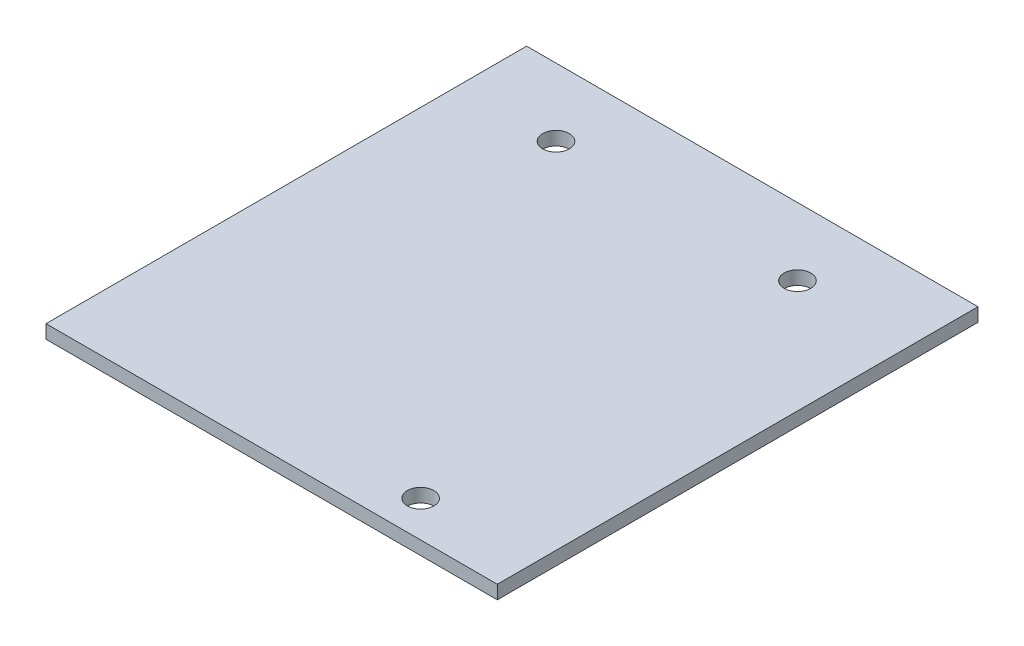
ISO-10303-21;
HEADER;
FILE_DESCRIPTION(('STEP AP214'),'2;1');
FILE_NAME('part.step','',(''),(''),'','','');
FILE_SCHEMA(('AUTOMOTIVE_DESIGN { 1 0 10303 214 1 1 1 1 }'));
ENDSEC;
DATA;
#1=APPLICATION_CONTEXT('core data for automotive mechanical design processes');
#2=APPLICATION_PROTOCOL_DEFINITION('international standard','automotive_design',2000,#1);
#3=PRODUCT_CONTEXT('',#1,'mechanical');
#4=PRODUCT('Part','Part','',(#3));
#5=PRODUCT_RELATED_PRODUCT_CATEGORY('part','',(#4));
#6=PRODUCT_DEFINITION_FORMATION('','',#4);
#7=PRODUCT_DEFINITION_CONTEXT('part definition',#1,'design');
#8=PRODUCT_DEFINITION('design','',#6,#7);
#9=PRODUCT_DEFINITION_SHAPE('','',#8);
#10=(LENGTH_UNIT() NAMED_UNIT(*) SI_UNIT(.MILLI.,.METRE.));
#11=(NAMED_UNIT(*) PLANE_ANGLE_UNIT() SI_UNIT($,.RADIAN.));
#12=(NAMED_UNIT(*) SI_UNIT($,.STERADIAN.) SOLID_ANGLE_UNIT());
#13=UNCERTAINTY_MEASURE_WITH_UNIT(LENGTH_MEASURE(1.E-05),#10,'distance_accuracy_value','');
#14=(GEOMETRIC_REPRESENTATION_CONTEXT(3) GLOBAL_UNCERTAINTY_ASSIGNED_CONTEXT((#13)) GLOBAL_UNIT_ASSIGNED_CONTEXT((#10,
#11,#12)) REPRESENTATION_CONTEXT('',''));
#15=CARTESIAN_POINT('',(0.,0.,0.));
#16=DIRECTION('',(0.,0.,1.));
#17=DIRECTION('',(1.,0.,0.));
#18=AXIS2_PLACEMENT_3D('',#15,#16,#17);
#19=CARTESIAN_POINT('',(25.4,1.524,-27.051));
#20=DIRECTION('',(-1.,0.,0.));
#21=DIRECTION('',(0.,0.,1.));
#22=AXIS2_PLACEMENT_3D('',#19,#20,#21);
#23=PLANE('',#22);
#24=DIRECTION('',(0.,0.,-1.));
#25=VECTOR('',#24,1.);
#26=CARTESIAN_POINT('',(25.4,0.,-27.051));
#27=LINE('',#26,#25);
#28=CARTESIAN_POINT('',(25.4,0.,27.051));
#29=VERTEX_POINT('',#28);
#30=CARTESIAN_POINT('',(25.4,0.,-27.051));
#31=VERTEX_POINT('',#30);
#32=EDGE_CURVE('E95',#29,#31,#27,.T.);
#33=ORIENTED_EDGE('',*,*,#32,.T.);
#34=DIRECTION('',(0.,-1.,0.));
#35=VECTOR('',#34,1.);
#36=CARTESIAN_POINT('',(25.4,1.524,-27.051));
#37=LINE('',#36,#35);
#38=CARTESIAN_POINT('',(25.4,1.524,-27.051));
#39=VERTEX_POINT('',#38);
#40=EDGE_CURVE('E11',#39,#31,#37,.T.);
#41=ORIENTED_EDGE('',*,*,#40,.F.);
#42=DIRECTION('',(0.,0.,-1.));
#43=VECTOR('',#42,1.);
#44=CARTESIAN_POINT('',(25.4,1.524,-27.051));
#45=LINE('',#44,#43);
#46=CARTESIAN_POINT('',(25.4,1.524,27.051));
#47=VERTEX_POINT('',#46);
#48=EDGE_CURVE('E83',#47,#39,#45,.T.);
#49=ORIENTED_EDGE('',*,*,#48,.F.);
#50=DIRECTION('',(0.,-1.,0.));
#51=VECTOR('',#50,1.);
#52=CARTESIAN_POINT('',(25.4,1.524,27.051));
#53=LINE('',#52,#51);
#54=EDGE_CURVE('E91',#47,#29,#53,.T.);
#55=ORIENTED_EDGE('',*,*,#54,.T.);
#56=EDGE_LOOP('',(#33,#41,#49,#55));
#57=FACE_BOUND('',#56,.T.);
#58=ADVANCED_FACE('F32',(#57),#23,.F.);
#59=CARTESIAN_POINT('',(-25.4,1.524,-27.051));
#60=DIRECTION('',(0.,0.,1.));
#61=DIRECTION('',(1.,0.,0.));
#62=AXIS2_PLACEMENT_3D('',#59,#60,#61);
#63=PLANE('',#62);
#64=DIRECTION('',(-1.,0.,0.));
#65=VECTOR('',#64,1.);
#66=CARTESIAN_POINT('',(-25.4,0.,-27.051));
#67=LINE('',#66,#65);
#68=CARTESIAN_POINT('',(-25.4,0.,-27.051));
#69=VERTEX_POINT('',#68);
#70=EDGE_CURVE('E87',#31,#69,#67,.T.);
#71=ORIENTED_EDGE('',*,*,#70,.T.);
#72=DIRECTION('',(0.,-1.,0.));
#73=VECTOR('',#72,1.);
#74=CARTESIAN_POINT('',(-25.4,1.524,-27.051));
#75=LINE('',#74,#73);
#76=CARTESIAN_POINT('',(-25.4,1.524,-27.051));
#77=VERTEX_POINT('',#76);
#78=EDGE_CURVE('E40',#77,#69,#75,.T.);
#79=ORIENTED_EDGE('',*,*,#78,.F.);
#80=DIRECTION('',(-1.,0.,0.));
#81=VECTOR('',#80,1.);
#82=CARTESIAN_POINT('',(-25.4,1.524,-27.051));
#83=LINE('',#82,#81);
#84=EDGE_CURVE('E78',#39,#77,#83,.T.);
#85=ORIENTED_EDGE('',*,*,#84,.F.);
#86=ORIENTED_EDGE('',*,*,#40,.T.);
#87=EDGE_LOOP('',(#71,#79,#85,#86));
#88=FACE_BOUND('',#87,.T.);
#89=ADVANCED_FACE('F86',(#88),#63,.F.);
#90=CARTESIAN_POINT('',(-25.4,1.524,-27.051));
#91=DIRECTION('',(1.,0.,0.));
#92=DIRECTION('',(0.,0.,-1.));
#93=AXIS2_PLACEMENT_3D('',#90,#91,#92);
#94=PLANE('',#93);
#95=DIRECTION('',(0.,0.,1.));
#96=VECTOR('',#95,1.);
#97=CARTESIAN_POINT('',(-25.4,0.,-27.051));
#98=LINE('',#97,#96);
#99=CARTESIAN_POINT('',(-25.4,0.,27.051));
#100=VERTEX_POINT('',#99);
#101=EDGE_CURVE('E65',#69,#100,#98,.T.);
#102=ORIENTED_EDGE('',*,*,#101,.T.);
#103=DIRECTION('',(0.,-1.,0.));
#104=VECTOR('',#103,1.);
#105=CARTESIAN_POINT('',(-25.4,1.524,27.051));
#106=LINE('',#105,#104);
#107=CARTESIAN_POINT('',(-25.4,1.524,27.051));
#108=VERTEX_POINT('',#107);
#109=EDGE_CURVE('E88',#108,#100,#106,.T.);
#110=ORIENTED_EDGE('',*,*,#109,.F.);
#111=DIRECTION('',(0.,0.,1.));
#112=VECTOR('',#111,1.);
#113=CARTESIAN_POINT('',(-25.4,1.524,-27.051));
#114=LINE('',#113,#112);
#115=EDGE_CURVE('E81',#77,#108,#114,.T.);
#116=ORIENTED_EDGE('',*,*,#115,.F.);
#117=ORIENTED_EDGE('',*,*,#78,.T.);
#118=EDGE_LOOP('',(#102,#110,#116,#117));
#119=FACE_BOUND('',#118,.T.);
#120=ADVANCED_FACE('F89',(#119),#94,.F.);
#121=CARTESIAN_POINT('',(-25.4,1.524,27.051));
#122=DIRECTION('',(0.,0.,-1.));
#123=DIRECTION('',(-1.,0.,0.));
#124=AXIS2_PLACEMENT_3D('',#121,#122,#123);
#125=PLANE('',#124);
#126=DIRECTION('',(1.,0.,0.));
#127=VECTOR('',#126,1.);
#128=CARTESIAN_POINT('',(-25.4,0.,27.051));
#129=LINE('',#128,#127);
#130=EDGE_CURVE('E71',#100,#29,#129,.T.);
#131=ORIENTED_EDGE('',*,*,#130,.T.);
#132=ORIENTED_EDGE('',*,*,#54,.F.);
#133=DIRECTION('',(1.,0.,0.));
#134=VECTOR('',#133,1.);
#135=CARTESIAN_POINT('',(-25.4,1.524,27.051));
#136=LINE('',#135,#134);
#137=EDGE_CURVE('E48',#108,#47,#136,.T.);
#138=ORIENTED_EDGE('',*,*,#137,.F.);
#139=ORIENTED_EDGE('',*,*,#109,.T.);
#140=EDGE_LOOP('',(#131,#132,#138,#139));
#141=FACE_BOUND('',#140,.T.);
#142=ADVANCED_FACE('F103',(#141),#125,.F.);
#143=CARTESIAN_POINT('',(0.,1.524,0.));
#144=DIRECTION('',(0.,1.,0.));
#145=DIRECTION('',(0.,0.,1.));
#146=AXIS2_PLACEMENT_3D('',#143,#144,#145);
#147=PLANE('',#146);
#148=CARTESIAN_POINT('',(12.7,1.524,22.987));
#149=DIRECTION('',(0.,1.,0.));
#150=DIRECTION('',(0.,0.,1.));
#151=AXIS2_PLACEMENT_3D('',#148,#149,#150);
#152=CIRCLE('',#151,1.4986);
#153=CARTESIAN_POINT('',(12.7,1.524,24.4856));
#154=VERTEX_POINT('',#153);
#155=EDGE_CURVE('E121',#154,#154,#152,.T.);
#156=ORIENTED_EDGE('',*,*,#155,.F.);
#157=EDGE_LOOP('',(#156));
#158=FACE_BOUND('',#157,.T.);
#159=CARTESIAN_POINT('',(12.7,1.524,-19.431));
#160=DIRECTION('',(0.,1.,0.));
#161=DIRECTION('',(0.,0.,1.));
#162=AXIS2_PLACEMENT_3D('',#159,#160,#161);
#163=CIRCLE('',#162,1.4986);
#164=CARTESIAN_POINT('',(12.7,1.524,-17.9324));
#165=VERTEX_POINT('',#164);
#166=EDGE_CURVE('E115',#165,#165,#163,.T.);
#167=ORIENTED_EDGE('',*,*,#166,.F.);
#168=EDGE_LOOP('',(#167));
#169=FACE_BOUND('',#168,.T.);
#170=CARTESIAN_POINT('',(-14.478,1.524,-19.431));
#171=DIRECTION('',(0.,1.,0.));
#172=DIRECTION('',(0.,0.,1.));
#173=AXIS2_PLACEMENT_3D('',#170,#171,#172);
#174=CIRCLE('',#173,1.4986);
#175=CARTESIAN_POINT('',(-14.478,1.524,-17.9324));
#176=VERTEX_POINT('',#175);
#177=EDGE_CURVE('E109',#176,#176,#174,.T.);
#178=ORIENTED_EDGE('',*,*,#177,.F.);
#179=EDGE_LOOP('',(#178));
#180=FACE_BOUND('',#179,.T.);
#181=ORIENTED_EDGE('',*,*,#48,.T.);
#182=ORIENTED_EDGE('',*,*,#84,.T.);
#183=ORIENTED_EDGE('',*,*,#115,.T.);
#184=ORIENTED_EDGE('',*,*,#137,.T.);
#185=EDGE_LOOP('',(#181,#182,#183,#184));
#186=FACE_BOUND('',#185,.T.);
#187=ADVANCED_FACE('F79',(#158,#169,#180,#186),#147,.T.);
#188=CARTESIAN_POINT('',(0.,0.,0.));
#189=DIRECTION('',(0.,1.,0.));
#190=DIRECTION('',(0.,0.,1.));
#191=AXIS2_PLACEMENT_3D('',#188,#189,#190);
#192=PLANE('',#191);
#193=CARTESIAN_POINT('',(12.7,0.,22.987));
#194=DIRECTION('',(0.,1.,0.));
#195=DIRECTION('',(0.,0.,1.));
#196=AXIS2_PLACEMENT_3D('',#193,#194,#195);
#197=CIRCLE('',#196,1.4986);
#198=CARTESIAN_POINT('',(12.7,0.,24.4856));
#199=VERTEX_POINT('',#198);
#200=EDGE_CURVE('E118',#199,#199,#197,.T.);
#201=ORIENTED_EDGE('',*,*,#200,.T.);
#202=EDGE_LOOP('',(#201));
#203=FACE_BOUND('',#202,.T.);
#204=CARTESIAN_POINT('',(12.7,0.,-19.431));
#205=DIRECTION('',(0.,1.,0.));
#206=DIRECTION('',(0.,0.,1.));
#207=AXIS2_PLACEMENT_3D('',#204,#205,#206);
#208=CIRCLE('',#207,1.4986);
#209=CARTESIAN_POINT('',(12.7,0.,-17.9324));
#210=VERTEX_POINT('',#209);
#211=EDGE_CURVE('E112',#210,#210,#208,.T.);
#212=ORIENTED_EDGE('',*,*,#211,.T.);
#213=EDGE_LOOP('',(#212));
#214=FACE_BOUND('',#213,.T.);
#215=CARTESIAN_POINT('',(-14.478,0.,-19.431));
#216=DIRECTION('',(0.,1.,0.));
#217=DIRECTION('',(0.,0.,1.));
#218=AXIS2_PLACEMENT_3D('',#215,#216,#217);
#219=CIRCLE('',#218,1.4986);
#220=CARTESIAN_POINT('',(-14.478,0.,-17.9324));
#221=VERTEX_POINT('',#220);
#222=EDGE_CURVE('E98',#221,#221,#219,.T.);
#223=ORIENTED_EDGE('',*,*,#222,.T.);
#224=EDGE_LOOP('',(#223));
#225=FACE_BOUND('',#224,.T.);
#226=ORIENTED_EDGE('',*,*,#32,.F.);
#227=ORIENTED_EDGE('',*,*,#130,.F.);
#228=ORIENTED_EDGE('',*,*,#101,.F.);
#229=ORIENTED_EDGE('',*,*,#70,.F.);
#230=EDGE_LOOP('',(#226,#227,#228,#229));
#231=FACE_BOUND('',#230,.T.);
#232=ADVANCED_FACE('F106',(#203,#214,#225,#231),#192,.F.);
#233=CARTESIAN_POINT('',(-14.478,0.,-19.431));
#234=DIRECTION('',(0.,1.,0.));
#235=DIRECTION('',(0.,0.,1.));
#236=AXIS2_PLACEMENT_3D('',#233,#234,#235);
#237=CYLINDRICAL_SURFACE('',#236,1.4986);
#238=CARTESIAN_POINT('',(-14.478,0.,-17.9324));
#239=CARTESIAN_POINT('',(-14.478,0.015875,-17.9324));
#240=CARTESIAN_POINT('',(-14.478,0.03175,-17.9324));
#241=CARTESIAN_POINT('',(-14.478,0.0635,-17.9324));
#242=CARTESIAN_POINT('',(-14.478,0.079375,-17.9324));
#243=CARTESIAN_POINT('',(-14.478,0.111125,-17.9324));
#244=CARTESIAN_POINT('',(-14.478,0.127,-17.9324));
#245=CARTESIAN_POINT('',(-14.478,0.15875,-17.9324));
#246=CARTESIAN_POINT('',(-14.478,0.174625,-17.9324));
#247=CARTESIAN_POINT('',(-14.478,0.206375,-17.9324));
#248=CARTESIAN_POINT('',(-14.478,0.22225,-17.9324));
#249=CARTESIAN_POINT('',(-14.478,0.254,-17.9324));
#250=CARTESIAN_POINT('',(-14.478,0.269875,-17.9324));
#251=CARTESIAN_POINT('',(-14.478,0.301625,-17.9324));
#252=CARTESIAN_POINT('',(-14.478,0.3175,-17.9324));
#253=CARTESIAN_POINT('',(-14.478,0.34925,-17.9324));
#254=CARTESIAN_POINT('',(-14.478,0.365125,-17.9324));
#255=CARTESIAN_POINT('',(-14.478,0.396875,-17.9324));
#256=CARTESIAN_POINT('',(-14.478,0.41275,-17.9324));
#257=CARTESIAN_POINT('',(-14.478,0.4445,-17.9324));
#258=CARTESIAN_POINT('',(-14.478,0.460375,-17.9324));
#259=CARTESIAN_POINT('',(-14.478,0.492125,-17.9324));
#260=CARTESIAN_POINT('',(-14.478,0.508,-17.9324));
#261=CARTESIAN_POINT('',(-14.478,0.53975,-17.9324));
#262=CARTESIAN_POINT('',(-14.478,0.555625,-17.9324));
#263=CARTESIAN_POINT('',(-14.478,0.587375,-17.9324));
#264=CARTESIAN_POINT('',(-14.478,0.60325,-17.9324));
#265=CARTESIAN_POINT('',(-14.478,0.635,-17.9324));
#266=CARTESIAN_POINT('',(-14.478,0.650875,-17.9324));
#267=CARTESIAN_POINT('',(-14.478,0.682625,-17.9324));
#268=CARTESIAN_POINT('',(-14.478,0.6985,-17.9324));
#269=CARTESIAN_POINT('',(-14.478,0.73025,-17.9324));
#270=CARTESIAN_POINT('',(-14.478,0.746125,-17.9324));
#271=CARTESIAN_POINT('',(-14.478,0.777875,-17.9324));
#272=CARTESIAN_POINT('',(-14.478,0.79375,-17.9324));
#273=CARTESIAN_POINT('',(-14.478,0.8255,-17.9324));
#274=CARTESIAN_POINT('',(-14.478,0.841375,-17.9324));
#275=CARTESIAN_POINT('',(-14.478,0.873125,-17.9324));
#276=CARTESIAN_POINT('',(-14.478,0.889,-17.9324));
#277=CARTESIAN_POINT('',(-14.478,0.92075,-17.9324));
#278=CARTESIAN_POINT('',(-14.478,0.936625,-17.9324));
#279=CARTESIAN_POINT('',(-14.478,0.968375,-17.9324));
#280=CARTESIAN_POINT('',(-14.478,0.98425,-17.9324));
#281=CARTESIAN_POINT('',(-14.478,1.016,-17.9324));
#282=CARTESIAN_POINT('',(-14.478,1.031875,-17.9324));
#283=CARTESIAN_POINT('',(-14.478,1.063625,-17.9324));
#284=CARTESIAN_POINT('',(-14.478,1.0795,-17.9324));
#285=CARTESIAN_POINT('',(-14.478,1.11125,-17.9324));
#286=CARTESIAN_POINT('',(-14.478,1.127125,-17.9324));
#287=CARTESIAN_POINT('',(-14.478,1.158875,-17.9324));
#288=CARTESIAN_POINT('',(-14.478,1.17475,-17.9324));
#289=CARTESIAN_POINT('',(-14.478,1.2065,-17.9324));
#290=CARTESIAN_POINT('',(-14.478,1.222375,-17.9324));
#291=CARTESIAN_POINT('',(-14.478,1.254125,-17.9324));
#292=CARTESIAN_POINT('',(-14.478,1.27,-17.9324));
#293=CARTESIAN_POINT('',(-14.478,1.30175,-17.9324));
#294=CARTESIAN_POINT('',(-14.478,1.317625,-17.9324));
#295=CARTESIAN_POINT('',(-14.478,1.349375,-17.9324));
#296=CARTESIAN_POINT('',(-14.478,1.36525,-17.9324));
#297=CARTESIAN_POINT('',(-14.478,1.397,-17.9324));
#298=CARTESIAN_POINT('',(-14.478,1.412875,-17.9324));
#299=CARTESIAN_POINT('',(-14.478,1.444625,-17.9324));
#300=CARTESIAN_POINT('',(-14.478,1.4605,-17.9324));
#301=CARTESIAN_POINT('',(-14.478,1.49225,-17.9324));
#302=CARTESIAN_POINT('',(-14.478,1.508125,-17.9324));
#303=CARTESIAN_POINT('',(-14.478,1.524,-17.9324));
#304=B_SPLINE_CURVE_WITH_KNOTS('',3,(#238,#239,#240,#241,#242,#243,#244,#245,#246,#247,#248,
#249,#250,#251,#252,#253,#254,#255,#256,#257,#258,#259,#260,#261,#262,#263,#264,#265,#266,#267,
#268,#269,#270,#271,#272,#273,#274,#275,#276,#277,#278,#279,#280,#281,#282,#283,#284,#285,#286,
#287,#288,#289,#290,#291,#292,#293,#294,#295,#296,#297,#298,#299,#300,#301,#302,#303),
.UNSPECIFIED.,.F.,.F.,(4,2,2,2,2,2,2,2,2,2,2,2,2,2,2,2,2,2,2,2,2,2,2,2,2,2,2,2,2,2,2,2,4),(0.,
0.047625,0.09525,0.142875,0.1905,0.238125,0.28575,0.333375,0.381,0.428625,0.47625,0.523875,
0.5715,0.619125,0.66675,0.714375,0.762,0.809625,0.85725,0.904875,0.9525,1.000125,1.04775,
1.095375,1.143,1.190625,1.23825,1.285875,1.3335,1.381125,1.42875,1.476375,1.524),.UNSPECIFIED.);
#305=EDGE_CURVE('BSEAM143',#221,#176,#304,.T.);
#306=ORIENTED_EDGE('',*,*,#222,.F.);
#307=ORIENTED_EDGE('',*,*,#177,.T.);
#308=ORIENTED_EDGE('',*,*,#305,.T.);
#309=ORIENTED_EDGE('',*,*,#305,.F.);
#310=EDGE_LOOP('',(#306,#308,#307,#309));
#311=FACE_BOUND('',#310,.T.);
#312=ADVANCED_FACE('F143',(#311),#237,.F.);
#313=CARTESIAN_POINT('',(12.7,0.,-19.431));
#314=DIRECTION('',(0.,1.,0.));
#315=DIRECTION('',(0.,0.,1.));
#316=AXIS2_PLACEMENT_3D('',#313,#314,#315);
#317=CYLINDRICAL_SURFACE('',#316,1.4986);
#318=CARTESIAN_POINT('',(12.7,0.,-17.9324));
#319=CARTESIAN_POINT('',(12.7,0.015875,-17.9324));
#320=CARTESIAN_POINT('',(12.7,0.03175,-17.9324));
#321=CARTESIAN_POINT('',(12.7,0.0635,-17.9324));
#322=CARTESIAN_POINT('',(12.7,0.079375,-17.9324));
#323=CARTESIAN_POINT('',(12.7,0.111125,-17.9324));
#324=CARTESIAN_POINT('',(12.7,0.127,-17.9324));
#325=CARTESIAN_POINT('',(12.7,0.15875,-17.9324));
#326=CARTESIAN_POINT('',(12.7,0.174625,-17.9324));
#327=CARTESIAN_POINT('',(12.7,0.206375,-17.9324));
#328=CARTESIAN_POINT('',(12.7,0.22225,-17.9324));
#329=CARTESIAN_POINT('',(12.7,0.254,-17.9324));
#330=CARTESIAN_POINT('',(12.7,0.269875,-17.9324));
#331=CARTESIAN_POINT('',(12.7,0.301625,-17.9324));
#332=CARTESIAN_POINT('',(12.7,0.3175,-17.9324));
#333=CARTESIAN_POINT('',(12.7,0.34925,-17.9324));
#334=CARTESIAN_POINT('',(12.7,0.365125,-17.9324));
#335=CARTESIAN_POINT('',(12.7,0.396875,-17.9324));
#336=CARTESIAN_POINT('',(12.7,0.41275,-17.9324));
#337=CARTESIAN_POINT('',(12.7,0.4445,-17.9324));
#338=CARTESIAN_POINT('',(12.7,0.460375,-17.9324));
#339=CARTESIAN_POINT('',(12.7,0.492125,-17.9324));
#340=CARTESIAN_POINT('',(12.7,0.508,-17.9324));
#341=CARTESIAN_POINT('',(12.7,0.53975,-17.9324));
#342=CARTESIAN_POINT('',(12.7,0.555625,-17.9324));
#343=CARTESIAN_POINT('',(12.7,0.587375,-17.9324));
#344=CARTESIAN_POINT('',(12.7,0.60325,-17.9324));
#345=CARTESIAN_POINT('',(12.7,0.635,-17.9324));
#346=CARTESIAN_POINT('',(12.7,0.650875,-17.9324));
#347=CARTESIAN_POINT('',(12.7,0.682625,-17.9324));
#348=CARTESIAN_POINT('',(12.7,0.6985,-17.9324));
#349=CARTESIAN_POINT('',(12.7,0.73025,-17.9324));
#350=CARTESIAN_POINT('',(12.7,0.746125,-17.9324));
#351=CARTESIAN_POINT('',(12.7,0.777875,-17.9324));
#352=CARTESIAN_POINT('',(12.7,0.79375,-17.9324));
#353=CARTESIAN_POINT('',(12.7,0.8255,-17.9324));
#354=CARTESIAN_POINT('',(12.7,0.841375,-17.9324));
#355=CARTESIAN_POINT('',(12.7,0.873125,-17.9324));
#356=CARTESIAN_POINT('',(12.7,0.889,-17.9324));
#357=CARTESIAN_POINT('',(12.7,0.92075,-17.9324));
#358=CARTESIAN_POINT('',(12.7,0.936625,-17.9324));
#359=CARTESIAN_POINT('',(12.7,0.968375,-17.9324));
#360=CARTESIAN_POINT('',(12.7,0.98425,-17.9324));
#361=CARTESIAN_POINT('',(12.7,1.016,-17.9324));
#362=CARTESIAN_POINT('',(12.7,1.031875,-17.9324));
#363=CARTESIAN_POINT('',(12.7,1.063625,-17.9324));
#364=CARTESIAN_POINT('',(12.7,1.0795,-17.9324));
#365=CARTESIAN_POINT('',(12.7,1.11125,-17.9324));
#366=CARTESIAN_POINT('',(12.7,1.127125,-17.9324));
#367=CARTESIAN_POINT('',(12.7,1.158875,-17.9324));
#368=CARTESIAN_POINT('',(12.7,1.17475,-17.9324));
#369=CARTESIAN_POINT('',(12.7,1.2065,-17.9324));
#370=CARTESIAN_POINT('',(12.7,1.222375,-17.9324));
#371=CARTESIAN_POINT('',(12.7,1.254125,-17.9324));
#372=CARTESIAN_POINT('',(12.7,1.27,-17.9324));
#373=CARTESIAN_POINT('',(12.7,1.30175,-17.9324));
#374=CARTESIAN_POINT('',(12.7,1.317625,-17.9324));
#375=CARTESIAN_POINT('',(12.7,1.349375,-17.9324));
#376=CARTESIAN_POINT('',(12.7,1.36525,-17.9324));
#377=CARTESIAN_POINT('',(12.7,1.397,-17.9324));
#378=CARTESIAN_POINT('',(12.7,1.412875,-17.9324));
#379=CARTESIAN_POINT('',(12.7,1.444625,-17.9324));
#380=CARTESIAN_POINT('',(12.7,1.4605,-17.9324));
#381=CARTESIAN_POINT('',(12.7,1.49225,-17.9324));
#382=CARTESIAN_POINT('',(12.7,1.508125,-17.9324));
#383=CARTESIAN_POINT('',(12.7,1.524,-17.9324));
#384=B_SPLINE_CURVE_WITH_KNOTS('',3,(#318,#319,#320,#321,#322,#323,#324,#325,#326,#327,#328,
#329,#330,#331,#332,#333,#334,#335,#336,#337,#338,#339,#340,#341,#342,#343,#344,#345,#346,#347,
#348,#349,#350,#351,#352,#353,#354,#355,#356,#357,#358,#359,#360,#361,#362,#363,#364,#365,#366,
#367,#368,#369,#370,#371,#372,#373,#374,#375,#376,#377,#378,#379,#380,#381,#382,#383),
.UNSPECIFIED.,.F.,.F.,(4,2,2,2,2,2,2,2,2,2,2,2,2,2,2,2,2,2,2,2,2,2,2,2,2,2,2,2,2,2,2,2,4),(0.,
0.047625,0.09525,0.142875,0.1905,0.238125,0.28575,0.333375,0.381,0.428625,0.47625,0.523875,
0.5715,0.619125,0.66675,0.714375,0.762,0.809625,0.85725,0.904875,0.9525,1.000125,1.04775,
1.095375,1.143,1.190625,1.23825,1.285875,1.3335,1.381125,1.42875,1.476375,1.524),.UNSPECIFIED.);
#385=EDGE_CURVE('BSEAM132',#210,#165,#384,.T.);
#386=ORIENTED_EDGE('',*,*,#211,.F.);
#387=ORIENTED_EDGE('',*,*,#166,.T.);
#388=ORIENTED_EDGE('',*,*,#385,.T.);
#389=ORIENTED_EDGE('',*,*,#385,.F.);
#390=EDGE_LOOP('',(#386,#388,#387,#389));
#391=FACE_BOUND('',#390,.T.);
#392=ADVANCED_FACE('F132',(#391),#317,.F.);
#393=CARTESIAN_POINT('',(12.7,0.,22.987));
#394=DIRECTION('',(0.,1.,0.));
#395=DIRECTION('',(0.,0.,1.));
#396=AXIS2_PLACEMENT_3D('',#393,#394,#395);
#397=CYLINDRICAL_SURFACE('',#396,1.4986);
#398=CARTESIAN_POINT('',(12.7,0.,24.4856));
#399=CARTESIAN_POINT('',(12.7,0.015875,24.4856));
#400=CARTESIAN_POINT('',(12.7,0.03175,24.4856));
#401=CARTESIAN_POINT('',(12.7,0.0635,24.4856));
#402=CARTESIAN_POINT('',(12.7,0.079375,24.4856));
#403=CARTESIAN_POINT('',(12.7,0.111125,24.4856));
#404=CARTESIAN_POINT('',(12.7,0.127,24.4856));
#405=CARTESIAN_POINT('',(12.7,0.15875,24.4856));
#406=CARTESIAN_POINT('',(12.7,0.174625,24.4856));
#407=CARTESIAN_POINT('',(12.7,0.206375,24.4856));
#408=CARTESIAN_POINT('',(12.7,0.22225,24.4856));
#409=CARTESIAN_POINT('',(12.7,0.254,24.4856));
#410=CARTESIAN_POINT('',(12.7,0.269875,24.4856));
#411=CARTESIAN_POINT('',(12.7,0.301625,24.4856));
#412=CARTESIAN_POINT('',(12.7,0.3175,24.4856));
#413=CARTESIAN_POINT('',(12.7,0.34925,24.4856));
#414=CARTESIAN_POINT('',(12.7,0.365125,24.4856));
#415=CARTESIAN_POINT('',(12.7,0.396875,24.4856));
#416=CARTESIAN_POINT('',(12.7,0.41275,24.4856));
#417=CARTESIAN_POINT('',(12.7,0.4445,24.4856));
#418=CARTESIAN_POINT('',(12.7,0.460375,24.4856));
#419=CARTESIAN_POINT('',(12.7,0.492125,24.4856));
#420=CARTESIAN_POINT('',(12.7,0.508,24.4856));
#421=CARTESIAN_POINT('',(12.7,0.53975,24.4856));
#422=CARTESIAN_POINT('',(12.7,0.555625,24.4856));
#423=CARTESIAN_POINT('',(12.7,0.587375,24.4856));
#424=CARTESIAN_POINT('',(12.7,0.60325,24.4856));
#425=CARTESIAN_POINT('',(12.7,0.635,24.4856));
#426=CARTESIAN_POINT('',(12.7,0.650875,24.4856));
#427=CARTESIAN_POINT('',(12.7,0.682625,24.4856));
#428=CARTESIAN_POINT('',(12.7,0.6985,24.4856));
#429=CARTESIAN_POINT('',(12.7,0.73025,24.4856));
#430=CARTESIAN_POINT('',(12.7,0.746125,24.4856));
#431=CARTESIAN_POINT('',(12.7,0.777875,24.4856));
#432=CARTESIAN_POINT('',(12.7,0.79375,24.4856));
#433=CARTESIAN_POINT('',(12.7,0.8255,24.4856));
#434=CARTESIAN_POINT('',(12.7,0.841375,24.4856));
#435=CARTESIAN_POINT('',(12.7,0.873125,24.4856));
#436=CARTESIAN_POINT('',(12.7,0.889,24.4856));
#437=CARTESIAN_POINT('',(12.7,0.92075,24.4856));
#438=CARTESIAN_POINT('',(12.7,0.936625,24.4856));
#439=CARTESIAN_POINT('',(12.7,0.968375,24.4856));
#440=CARTESIAN_POINT('',(12.7,0.98425,24.4856));
#441=CARTESIAN_POINT('',(12.7,1.016,24.4856));
#442=CARTESIAN_POINT('',(12.7,1.031875,24.4856));
#443=CARTESIAN_POINT('',(12.7,1.063625,24.4856));
#444=CARTESIAN_POINT('',(12.7,1.0795,24.4856));
#445=CARTESIAN_POINT('',(12.7,1.11125,24.4856));
#446=CARTESIAN_POINT('',(12.7,1.127125,24.4856));
#447=CARTESIAN_POINT('',(12.7,1.158875,24.4856));
#448=CARTESIAN_POINT('',(12.7,1.17475,24.4856));
#449=CARTESIAN_POINT('',(12.7,1.2065,24.4856));
#450=CARTESIAN_POINT('',(12.7,1.222375,24.4856));
#451=CARTESIAN_POINT('',(12.7,1.254125,24.4856));
#452=CARTESIAN_POINT('',(12.7,1.27,24.4856));
#453=CARTESIAN_POINT('',(12.7,1.30175,24.4856));
#454=CARTESIAN_POINT('',(12.7,1.317625,24.4856));
#455=CARTESIAN_POINT('',(12.7,1.349375,24.4856));
#456=CARTESIAN_POINT('',(12.7,1.36525,24.4856));
#457=CARTESIAN_POINT('',(12.7,1.397,24.4856));
#458=CARTESIAN_POINT('',(12.7,1.412875,24.4856));
#459=CARTESIAN_POINT('',(12.7,1.444625,24.4856));
#460=CARTESIAN_POINT('',(12.7,1.4605,24.4856));
#461=CARTESIAN_POINT('',(12.7,1.49225,24.4856));
#462=CARTESIAN_POINT('',(12.7,1.508125,24.4856));
#463=CARTESIAN_POINT('',(12.7,1.524,24.4856));
#464=B_SPLINE_CURVE_WITH_KNOTS('',3,(#398,#399,#400,#401,#402,#403,#404,#405,#406,#407,#408,
#409,#410,#411,#412,#413,#414,#415,#416,#417,#418,#419,#420,#421,#422,#423,#424,#425,#426,#427,
#428,#429,#430,#431,#432,#433,#434,#435,#436,#437,#438,#439,#440,#441,#442,#443,#444,#445,#446,
#447,#448,#449,#450,#451,#452,#453,#454,#455,#456,#457,#458,#459,#460,#461,#462,#463),
.UNSPECIFIED.,.F.,.F.,(4,2,2,2,2,2,2,2,2,2,2,2,2,2,2,2,2,2,2,2,2,2,2,2,2,2,2,2,2,2,2,2,4),(0.,
0.047625,0.09525,0.142875,0.1905,0.238125,0.28575,0.333375,0.381,0.428625,0.47625,0.523875,
0.5715,0.619125,0.66675,0.714375,0.762,0.809625,0.85725,0.904875,0.9525,1.000125,1.04775,
1.095375,1.143,1.190625,1.23825,1.285875,1.3335,1.381125,1.42875,1.476375,1.524),.UNSPECIFIED.);
#465=EDGE_CURVE('BSEAM129',#199,#154,#464,.T.);
#466=ORIENTED_EDGE('',*,*,#200,.F.);
#467=ORIENTED_EDGE('',*,*,#155,.T.);
#468=ORIENTED_EDGE('',*,*,#465,.T.);
#469=ORIENTED_EDGE('',*,*,#465,.F.);
#470=EDGE_LOOP('',(#466,#468,#467,#469));
#471=FACE_BOUND('',#470,.T.);
#472=ADVANCED_FACE('F129',(#471),#397,.F.);
#473=CLOSED_SHELL('',(#58,#89,#120,#142,#187,#232,#312,#392,#472));
#474=MANIFOLD_SOLID_BREP('B2',#473);
#475=ADVANCED_BREP_SHAPE_REPRESENTATION('',(#18,#474),#14);
#476=SHAPE_DEFINITION_REPRESENTATION(#9,#475);
ENDSEC;
END-ISO-10303-21;
